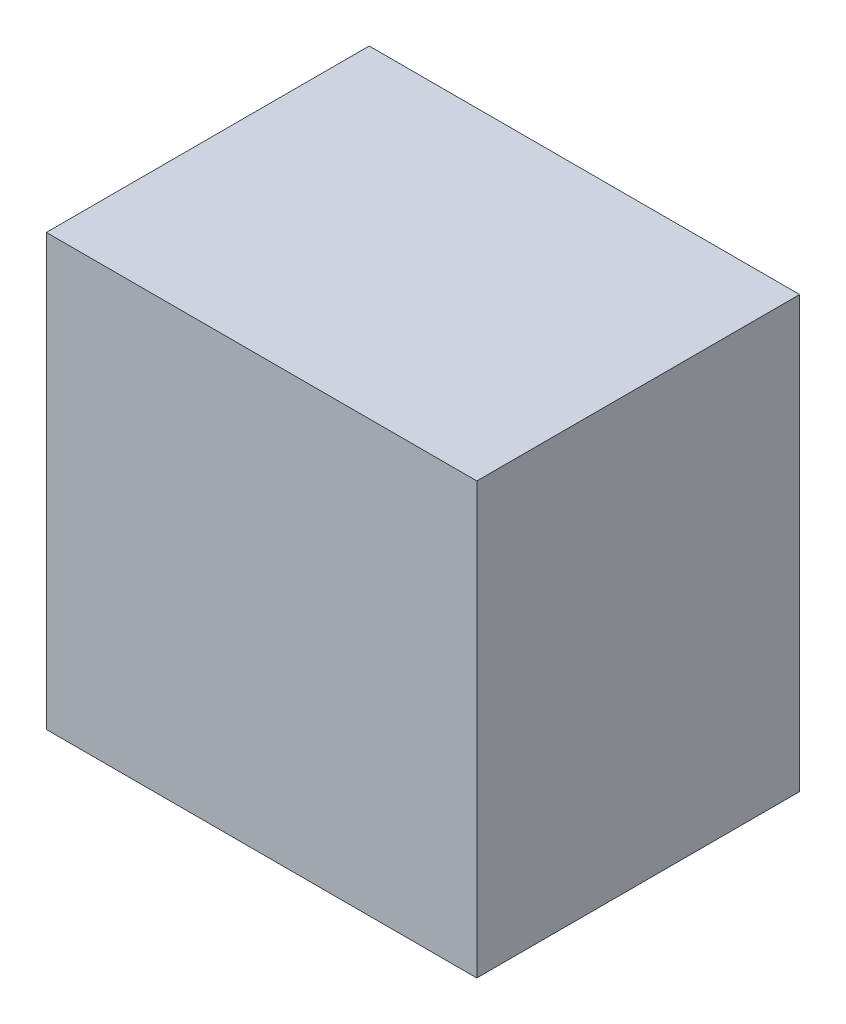
ISO-10303-21;
HEADER;
FILE_DESCRIPTION(('STEP AP214'),'2;1');
FILE_NAME('part.step','',(''),(''),'','','');
FILE_SCHEMA(('AUTOMOTIVE_DESIGN { 1 0 10303 214 1 1 1 1 }'));
ENDSEC;
DATA;
#1=APPLICATION_CONTEXT('core data for automotive mechanical design processes');
#2=APPLICATION_PROTOCOL_DEFINITION('international standard','automotive_design',2000,#1);
#3=PRODUCT_CONTEXT('',#1,'mechanical');
#4=PRODUCT('Part','Part','',(#3));
#5=PRODUCT_RELATED_PRODUCT_CATEGORY('part','',(#4));
#6=PRODUCT_DEFINITION_FORMATION('','',#4);
#7=PRODUCT_DEFINITION_CONTEXT('part definition',#1,'design');
#8=PRODUCT_DEFINITION('design','',#6,#7);
#9=PRODUCT_DEFINITION_SHAPE('','',#8);
#10=(LENGTH_UNIT() NAMED_UNIT(*) SI_UNIT(.MILLI.,.METRE.));
#11=(NAMED_UNIT(*) PLANE_ANGLE_UNIT() SI_UNIT($,.RADIAN.));
#12=(NAMED_UNIT(*) SI_UNIT($,.STERADIAN.) SOLID_ANGLE_UNIT());
#13=UNCERTAINTY_MEASURE_WITH_UNIT(LENGTH_MEASURE(1.E-05),#10,'distance_accuracy_value','');
#14=(GEOMETRIC_REPRESENTATION_CONTEXT(3) GLOBAL_UNCERTAINTY_ASSIGNED_CONTEXT((#13)) GLOBAL_UNIT_ASSIGNED_CONTEXT((#10,
#11,#12)) REPRESENTATION_CONTEXT('',''));
#15=CARTESIAN_POINT('',(0.,0.,0.));
#16=DIRECTION('',(0.,0.,1.));
#17=DIRECTION('',(1.,0.,0.));
#18=AXIS2_PLACEMENT_3D('',#15,#16,#17);
#19=CARTESIAN_POINT('',(60.,200.,-248.));
#20=DIRECTION('',(-1.,0.,0.));
#21=DIRECTION('',(0.,0.,1.));
#22=AXIS2_PLACEMENT_3D('',#19,#20,#21);
#23=PLANE('',#22);
#24=DIRECTION('',(0.,-1.,0.));
#25=VECTOR('',#24,1.);
#26=CARTESIAN_POINT('',(60.,200.,-173.));
#27=LINE('',#26,#25);
#28=CARTESIAN_POINT('',(60.,300.,-173.));
#29=VERTEX_POINT('',#28);
#30=CARTESIAN_POINT('',(60.,200.,-173.));
#31=VERTEX_POINT('',#30);
#32=EDGE_CURVE('E103',#29,#31,#27,.T.);
#33=ORIENTED_EDGE('',*,*,#32,.F.);
#34=DIRECTION('',(0.,0.,1.));
#35=VECTOR('',#34,1.);
#36=CARTESIAN_POINT('',(60.,300.,-248.));
#37=LINE('',#36,#35);
#38=CARTESIAN_POINT('',(60.,300.,-248.));
#39=VERTEX_POINT('',#38);
#40=EDGE_CURVE('E11',#39,#29,#37,.T.);
#41=ORIENTED_EDGE('',*,*,#40,.F.);
#42=DIRECTION('',(0.,-1.,0.));
#43=VECTOR('',#42,1.);
#44=CARTESIAN_POINT('',(60.,200.,-248.));
#45=LINE('',#44,#43);
#46=CARTESIAN_POINT('',(60.,200.,-248.));
#47=VERTEX_POINT('',#46);
#48=EDGE_CURVE('E97',#39,#47,#45,.T.);
#49=ORIENTED_EDGE('',*,*,#48,.T.);
#50=DIRECTION('',(0.,0.,1.));
#51=VECTOR('',#50,1.);
#52=CARTESIAN_POINT('',(60.,200.,-248.));
#53=LINE('',#52,#51);
#54=EDGE_CURVE('E42',#47,#31,#53,.T.);
#55=ORIENTED_EDGE('',*,*,#54,.T.);
#56=EDGE_LOOP('',(#33,#41,#49,#55));
#57=FACE_BOUND('',#56,.T.);
#58=ADVANCED_FACE('F39',(#57),#23,.T.);
#59=CARTESIAN_POINT('',(60.,300.,-248.));
#60=DIRECTION('',(0.,1.,0.));
#61=DIRECTION('',(0.,0.,1.));
#62=AXIS2_PLACEMENT_3D('',#59,#60,#61);
#63=PLANE('',#62);
#64=DIRECTION('',(-1.,0.,0.));
#65=VECTOR('',#64,1.);
#66=CARTESIAN_POINT('',(60.,300.,-173.));
#67=LINE('',#66,#65);
#68=CARTESIAN_POINT('',(160.,300.,-173.));
#69=VERTEX_POINT('',#68);
#70=EDGE_CURVE('E99',#69,#29,#67,.T.);
#71=ORIENTED_EDGE('',*,*,#70,.F.);
#72=DIRECTION('',(0.,0.,1.));
#73=VECTOR('',#72,1.);
#74=CARTESIAN_POINT('',(160.,300.,-248.));
#75=LINE('',#74,#73);
#76=CARTESIAN_POINT('',(160.,300.,-248.));
#77=VERTEX_POINT('',#76);
#78=EDGE_CURVE('E48',#77,#69,#75,.T.);
#79=ORIENTED_EDGE('',*,*,#78,.F.);
#80=DIRECTION('',(-1.,0.,0.));
#81=VECTOR('',#80,1.);
#82=CARTESIAN_POINT('',(60.,300.,-248.));
#83=LINE('',#82,#81);
#84=EDGE_CURVE('E94',#77,#39,#83,.T.);
#85=ORIENTED_EDGE('',*,*,#84,.T.);
#86=ORIENTED_EDGE('',*,*,#40,.T.);
#87=EDGE_LOOP('',(#71,#79,#85,#86));
#88=FACE_BOUND('',#87,.T.);
#89=ADVANCED_FACE('F113',(#88),#63,.T.);
#90=CARTESIAN_POINT('',(160.,200.,-248.));
#91=DIRECTION('',(1.,0.,0.));
#92=DIRECTION('',(0.,0.,-1.));
#93=AXIS2_PLACEMENT_3D('',#90,#91,#92);
#94=PLANE('',#93);
#95=DIRECTION('',(0.,1.,0.));
#96=VECTOR('',#95,1.);
#97=CARTESIAN_POINT('',(160.,200.,-173.));
#98=LINE('',#97,#96);
#99=CARTESIAN_POINT('',(160.,200.,-173.));
#100=VERTEX_POINT('',#99);
#101=EDGE_CURVE('E89',#100,#69,#98,.T.);
#102=ORIENTED_EDGE('',*,*,#101,.F.);
#103=DIRECTION('',(0.,0.,1.));
#104=VECTOR('',#103,1.);
#105=CARTESIAN_POINT('',(160.,200.,-248.));
#106=LINE('',#105,#104);
#107=CARTESIAN_POINT('',(160.,200.,-248.));
#108=VERTEX_POINT('',#107);
#109=EDGE_CURVE('E84',#108,#100,#106,.T.);
#110=ORIENTED_EDGE('',*,*,#109,.F.);
#111=DIRECTION('',(0.,1.,0.));
#112=VECTOR('',#111,1.);
#113=CARTESIAN_POINT('',(160.,200.,-248.));
#114=LINE('',#113,#112);
#115=EDGE_CURVE('E87',#108,#77,#114,.T.);
#116=ORIENTED_EDGE('',*,*,#115,.T.);
#117=ORIENTED_EDGE('',*,*,#78,.T.);
#118=EDGE_LOOP('',(#102,#110,#116,#117));
#119=FACE_BOUND('',#118,.T.);
#120=ADVANCED_FACE('F86',(#119),#94,.T.);
#121=CARTESIAN_POINT('',(60.,200.,-248.));
#122=DIRECTION('',(0.,-1.,0.));
#123=DIRECTION('',(0.,0.,-1.));
#124=AXIS2_PLACEMENT_3D('',#121,#122,#123);
#125=PLANE('',#124);
#126=DIRECTION('',(1.,0.,0.));
#127=VECTOR('',#126,1.);
#128=CARTESIAN_POINT('',(60.,200.,-173.));
#129=LINE('',#128,#127);
#130=EDGE_CURVE('E106',#31,#100,#129,.T.);
#131=ORIENTED_EDGE('',*,*,#130,.F.);
#132=ORIENTED_EDGE('',*,*,#54,.F.);
#133=DIRECTION('',(1.,0.,0.));
#134=VECTOR('',#133,1.);
#135=CARTESIAN_POINT('',(60.,200.,-248.));
#136=LINE('',#135,#134);
#137=EDGE_CURVE('E93',#47,#108,#136,.T.);
#138=ORIENTED_EDGE('',*,*,#137,.T.);
#139=ORIENTED_EDGE('',*,*,#109,.T.);
#140=EDGE_LOOP('',(#131,#132,#138,#139));
#141=FACE_BOUND('',#140,.T.);
#142=ADVANCED_FACE('F96',(#141),#125,.T.);
#143=CARTESIAN_POINT('',(0.,0.,-248.));
#144=DIRECTION('',(0.,0.,-1.));
#145=DIRECTION('',(-1.,0.,0.));
#146=AXIS2_PLACEMENT_3D('',#143,#144,#145);
#147=PLANE('',#146);
#148=ORIENTED_EDGE('',*,*,#48,.F.);
#149=ORIENTED_EDGE('',*,*,#84,.F.);
#150=ORIENTED_EDGE('',*,*,#115,.F.);
#151=ORIENTED_EDGE('',*,*,#137,.F.);
#152=EDGE_LOOP('',(#148,#149,#150,#151));
#153=FACE_BOUND('',#152,.T.);
#154=ADVANCED_FACE('F92',(#153),#147,.T.);
#155=CARTESIAN_POINT('',(0.,0.,-173.));
#156=DIRECTION('',(0.,0.,-1.));
#157=DIRECTION('',(-1.,0.,0.));
#158=AXIS2_PLACEMENT_3D('',#155,#156,#157);
#159=PLANE('',#158);
#160=ORIENTED_EDGE('',*,*,#32,.T.);
#161=ORIENTED_EDGE('',*,*,#130,.T.);
#162=ORIENTED_EDGE('',*,*,#101,.T.);
#163=ORIENTED_EDGE('',*,*,#70,.T.);
#164=EDGE_LOOP('',(#160,#161,#162,#163));
#165=FACE_BOUND('',#164,.T.);
#166=ADVANCED_FACE('F112',(#165),#159,.F.);
#167=CLOSED_SHELL('',(#58,#89,#120,#142,#154,#166));
#168=MANIFOLD_SOLID_BREP('B2',#167);
#169=ADVANCED_BREP_SHAPE_REPRESENTATION('',(#18,#168),#14);
#170=SHAPE_DEFINITION_REPRESENTATION(#9,#169);
ENDSEC;
END-ISO-10303-21;
